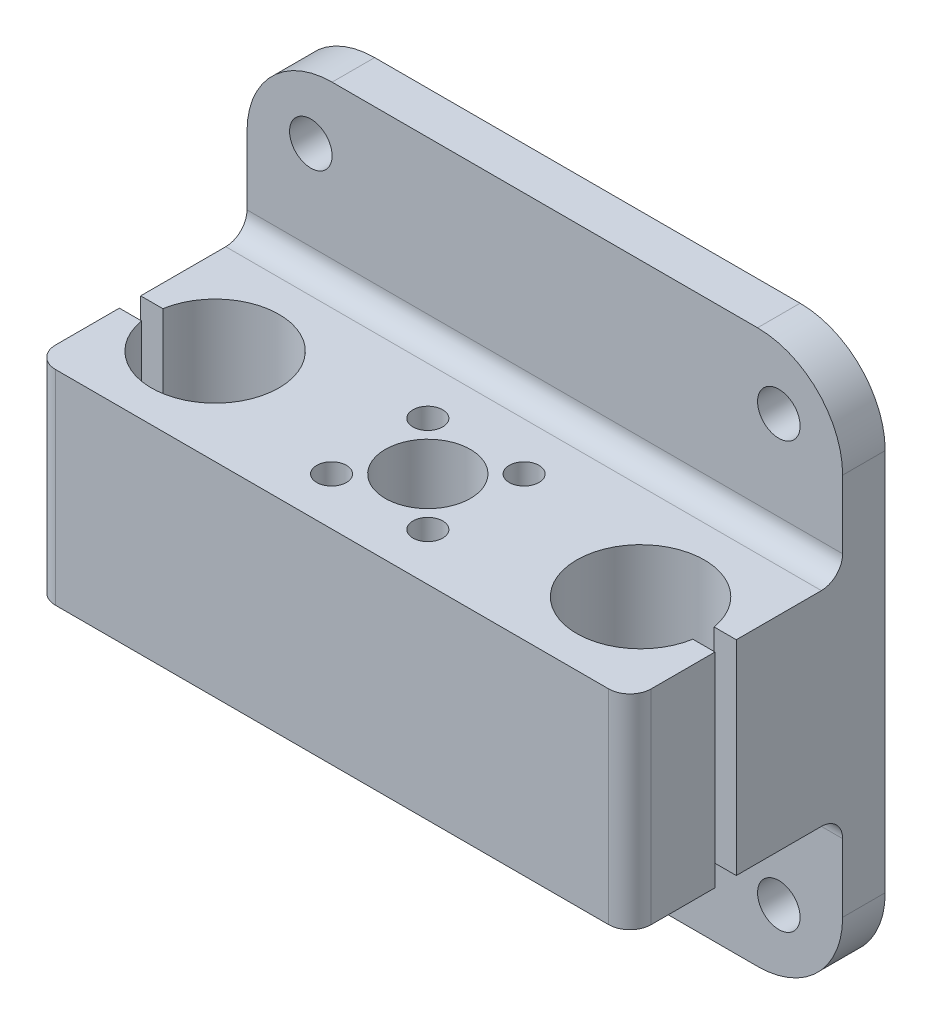
ISO-10303-21;
HEADER;
FILE_DESCRIPTION(('STEP AP214'),'2;1');
FILE_NAME('part.step','',(''),(''),'','','');
FILE_SCHEMA(('AUTOMOTIVE_DESIGN { 1 0 10303 214 1 1 1 1 }'));
ENDSEC;
DATA;
#1=APPLICATION_CONTEXT('core data for automotive mechanical design processes');
#2=APPLICATION_PROTOCOL_DEFINITION('international standard','automotive_design',2000,#1);
#3=PRODUCT_CONTEXT('',#1,'mechanical');
#4=PRODUCT('Part','Part','',(#3));
#5=PRODUCT_RELATED_PRODUCT_CATEGORY('part','',(#4));
#6=PRODUCT_DEFINITION_FORMATION('','',#4);
#7=PRODUCT_DEFINITION_CONTEXT('part definition',#1,'design');
#8=PRODUCT_DEFINITION('design','',#6,#7);
#9=PRODUCT_DEFINITION_SHAPE('','',#8);
#10=(LENGTH_UNIT() NAMED_UNIT(*) SI_UNIT(.MILLI.,.METRE.));
#11=(NAMED_UNIT(*) PLANE_ANGLE_UNIT() SI_UNIT($,.RADIAN.));
#12=(NAMED_UNIT(*) SI_UNIT($,.STERADIAN.) SOLID_ANGLE_UNIT());
#13=UNCERTAINTY_MEASURE_WITH_UNIT(LENGTH_MEASURE(1.E-05),#10,'distance_accuracy_value','');
#14=(GEOMETRIC_REPRESENTATION_CONTEXT(3) GLOBAL_UNCERTAINTY_ASSIGNED_CONTEXT((#13)) GLOBAL_UNIT_ASSIGNED_CONTEXT((#10,
#11,#12)) REPRESENTATION_CONTEXT('',''));
#15=CARTESIAN_POINT('',(0.,0.,0.));
#16=DIRECTION('',(0.,0.,1.));
#17=DIRECTION('',(1.,0.,0.));
#18=AXIS2_PLACEMENT_3D('',#15,#16,#17);
#19=CARTESIAN_POINT('',(-50.4878048780488,18.1707317073171,5.));
#20=DIRECTION('',(1.,0.,0.));
#21=DIRECTION('',(0.,1.,0.));
#22=AXIS2_PLACEMENT_3D('',#19,#20,#21);
#23=PLANE('',#22);
#24=DIRECTION('',(0.,0.,-1.));
#25=VECTOR('',#24,1.);
#26=CARTESIAN_POINT('',(-50.4878048780488,-26.3292682926829,30.));
#27=LINE('',#26,#25);
#28=CARTESIAN_POINT('',(-50.4878048780488,-26.3292682926829,17.5));
#29=VERTEX_POINT('',#28);
#30=CARTESIAN_POINT('',(-50.4878048780488,-26.3292682926829,7.5));
#31=VERTEX_POINT('',#30);
#32=EDGE_CURVE('E248',#29,#31,#27,.T.);
#33=ORIENTED_EDGE('',*,*,#32,.F.);
#34=DIRECTION('',(0.,1.,0.));
#35=VECTOR('',#34,1.);
#36=CARTESIAN_POINT('',(-50.4878048780488,18.1707317073171,17.5));
#37=LINE('',#36,#35);
#38=CARTESIAN_POINT('',(-50.4878048780488,-2.32926829268293,17.5));
#39=VERTEX_POINT('',#38);
#40=EDGE_CURVE('E480',#29,#39,#37,.T.);
#41=ORIENTED_EDGE('',*,*,#40,.T.);
#42=DIRECTION('',(0.,0.,-1.));
#43=VECTOR('',#42,1.);
#44=CARTESIAN_POINT('',(-50.4878048780488,-2.32926829268293,30.));
#45=LINE('',#44,#43);
#46=CARTESIAN_POINT('',(-50.4878048780488,-2.32926829268293,7.5));
#47=VERTEX_POINT('',#46);
#48=EDGE_CURVE('E240',#39,#47,#45,.T.);
#49=ORIENTED_EDGE('',*,*,#48,.T.);
#50=CARTESIAN_POINT('',(-50.4878048780488,0.170731707317066,7.5));
#51=DIRECTION('',(1.,0.,0.));
#52=DIRECTION('',(0.,1.,0.));
#53=AXIS2_PLACEMENT_3D('',#50,#51,#52);
#54=CIRCLE('',#53,2.5);
#55=CARTESIAN_POINT('',(-50.4878048780488,0.170731707317066,5.));
#56=VERTEX_POINT('',#55);
#57=EDGE_CURVE('E393',#47,#56,#54,.T.);
#58=ORIENTED_EDGE('',*,*,#57,.T.);
#59=DIRECTION('',(0.,-1.,0.));
#60=VECTOR('',#59,1.);
#61=CARTESIAN_POINT('',(-50.4878048780488,18.1707317073171,5.));
#62=LINE('',#61,#60);
#63=CARTESIAN_POINT('',(-50.4878048780488,8.17073170731707,5.));
#64=VERTEX_POINT('',#63);
#65=EDGE_CURVE('E286',#64,#56,#62,.T.);
#66=ORIENTED_EDGE('',*,*,#65,.F.);
#67=DIRECTION('',(0.,0.,-1.));
#68=VECTOR('',#67,1.);
#69=CARTESIAN_POINT('',(-50.4878048780488,8.17073170731707,5.));
#70=LINE('',#69,#68);
#71=CARTESIAN_POINT('',(-50.4878048780488,8.17073170731707,0.));
#72=VERTEX_POINT('',#71);
#73=EDGE_CURVE('E365',#64,#72,#70,.T.);
#74=ORIENTED_EDGE('',*,*,#73,.T.);
#75=DIRECTION('',(0.,-1.,0.));
#76=VECTOR('',#75,1.);
#77=CARTESIAN_POINT('',(-50.4878048780488,18.1707317073171,0.));
#78=LINE('',#77,#76);
#79=CARTESIAN_POINT('',(-50.4878048780488,-36.8292682926829,0.));
#80=VERTEX_POINT('',#79);
#81=EDGE_CURVE('E282',#72,#80,#78,.T.);
#82=ORIENTED_EDGE('',*,*,#81,.T.);
#83=DIRECTION('',(0.,0.,-1.));
#84=VECTOR('',#83,1.);
#85=CARTESIAN_POINT('',(-50.4878048780488,-36.8292682926829,5.));
#86=LINE('',#85,#84);
#87=CARTESIAN_POINT('',(-50.4878048780488,-36.8292682926829,5.));
#88=VERTEX_POINT('',#87);
#89=EDGE_CURVE('E369',#80,#88,#86,.F.);
#90=ORIENTED_EDGE('',*,*,#89,.T.);
#91=CARTESIAN_POINT('',(-50.4878048780488,-28.8292682926829,5.));
#92=VERTEX_POINT('',#91);
#93=EDGE_CURVE('E291',#92,#88,#62,.T.);
#94=ORIENTED_EDGE('',*,*,#93,.F.);
#95=CARTESIAN_POINT('',(-50.4878048780488,-28.8292682926829,7.5));
#96=DIRECTION('',(1.,0.,0.));
#97=DIRECTION('',(0.,1.,0.));
#98=AXIS2_PLACEMENT_3D('',#95,#96,#97);
#99=CIRCLE('',#98,2.5);
#100=EDGE_CURVE('E389',#92,#31,#99,.T.);
#101=ORIENTED_EDGE('',*,*,#100,.T.);
#102=EDGE_LOOP('',(#33,#41,#49,#58,#66,#74,#82,#90,#94,#101));
#103=FACE_BOUND('',#102,.T.);
#104=ADVANCED_FACE('F39',(#103),#23,.F.);
#105=CARTESIAN_POINT('',(19.5121951219512,18.1707317073171,5.));
#106=DIRECTION('',(-1.,0.,0.));
#107=DIRECTION('',(0.,-1.,0.));
#108=AXIS2_PLACEMENT_3D('',#105,#106,#107);
#109=PLANE('',#108);
#110=DIRECTION('',(0.,0.,-1.));
#111=VECTOR('',#110,1.);
#112=CARTESIAN_POINT('',(19.5121951219512,-26.3292682926829,30.));
#113=LINE('',#112,#111);
#114=CARTESIAN_POINT('',(19.5121951219512,-26.3292682926829,27.5));
#115=VERTEX_POINT('',#114);
#116=CARTESIAN_POINT('',(19.5121951219512,-26.3292682926829,20.));
#117=VERTEX_POINT('',#116);
#118=EDGE_CURVE('E244',#115,#117,#113,.T.);
#119=ORIENTED_EDGE('',*,*,#118,.T.);
#120=DIRECTION('',(0.,1.,0.));
#121=VECTOR('',#120,1.);
#122=CARTESIAN_POINT('',(19.5121951219512,18.1707317073171,20.));
#123=LINE('',#122,#121);
#124=CARTESIAN_POINT('',(19.5121951219512,-2.32926829268293,20.));
#125=VERTEX_POINT('',#124);
#126=EDGE_CURVE('E580',#117,#125,#123,.T.);
#127=ORIENTED_EDGE('',*,*,#126,.T.);
#128=DIRECTION('',(0.,0.,-1.));
#129=VECTOR('',#128,1.);
#130=CARTESIAN_POINT('',(19.5121951219512,-2.32926829268293,30.));
#131=LINE('',#130,#129);
#132=CARTESIAN_POINT('',(19.5121951219512,-2.32926829268293,27.5));
#133=VERTEX_POINT('',#132);
#134=EDGE_CURVE('E232',#133,#125,#131,.T.);
#135=ORIENTED_EDGE('',*,*,#134,.F.);
#136=DIRECTION('',(0.,1.,0.));
#137=VECTOR('',#136,1.);
#138=CARTESIAN_POINT('',(19.5121951219512,-26.3292682926829,27.5));
#139=LINE('',#138,#137);
#140=EDGE_CURVE('E412',#133,#115,#139,.F.);
#141=ORIENTED_EDGE('',*,*,#140,.T.);
#142=EDGE_LOOP('',(#119,#127,#135,#141));
#143=FACE_BOUND('',#142,.T.);
#144=ADVANCED_FACE('F547',(#143),#109,.F.);
#145=CARTESIAN_POINT('',(0.,0.,5.));
#146=DIRECTION('',(0.,0.,1.));
#147=DIRECTION('',(1.,0.,0.));
#148=AXIS2_PLACEMENT_3D('',#145,#146,#147);
#149=PLANE('',#148);
#150=ORIENTED_EDGE('',*,*,#65,.T.);
#151=DIRECTION('',(-1.,0.,0.));
#152=VECTOR('',#151,1.);
#153=CARTESIAN_POINT('',(0.,0.170731707317072,5.));
#154=LINE('',#153,#152);
#155=CARTESIAN_POINT('',(19.5121951219512,0.170731707317073,5.));
#156=VERTEX_POINT('',#155);
#157=EDGE_CURVE('E383',#56,#156,#154,.F.);
#158=ORIENTED_EDGE('',*,*,#157,.T.);
#159=DIRECTION('',(0.,1.,0.));
#160=VECTOR('',#159,1.);
#161=CARTESIAN_POINT('',(19.5121951219512,18.1707317073171,5.));
#162=LINE('',#161,#160);
#163=CARTESIAN_POINT('',(19.5121951219512,8.17073170731707,5.));
#164=VERTEX_POINT('',#163);
#165=EDGE_CURVE('E295',#156,#164,#162,.T.);
#166=ORIENTED_EDGE('',*,*,#165,.T.);
#167=CARTESIAN_POINT('',(9.51219512195122,8.17073170731707,5.));
#168=DIRECTION('',(0.,0.,1.));
#169=DIRECTION('',(1.,0.,0.));
#170=AXIS2_PLACEMENT_3D('',#167,#168,#169);
#171=CIRCLE('',#170,10.);
#172=CARTESIAN_POINT('',(9.51219512195122,18.1707317073171,5.));
#173=VERTEX_POINT('',#172);
#174=EDGE_CURVE('E352',#164,#173,#171,.T.);
#175=ORIENTED_EDGE('',*,*,#174,.T.);
#176=DIRECTION('',(-1.,0.,0.));
#177=VECTOR('',#176,1.);
#178=CARTESIAN_POINT('',(-50.4878048780488,18.1707317073171,5.));
#179=LINE('',#178,#177);
#180=CARTESIAN_POINT('',(-40.4878048780488,18.1707317073171,5.));
#181=VERTEX_POINT('',#180);
#182=EDGE_CURVE('E300',#173,#181,#179,.T.);
#183=ORIENTED_EDGE('',*,*,#182,.T.);
#184=CARTESIAN_POINT('',(-40.4878048780488,8.17073170731707,5.));
#185=DIRECTION('',(0.,0.,1.));
#186=DIRECTION('',(1.,0.,0.));
#187=AXIS2_PLACEMENT_3D('',#184,#185,#186);
#188=CIRCLE('',#187,10.);
#189=EDGE_CURVE('E346',#181,#64,#188,.T.);
#190=ORIENTED_EDGE('',*,*,#189,.T.);
#191=EDGE_LOOP('',(#150,#158,#166,#175,#183,#190));
#192=FACE_BOUND('',#191,.T.);
#193=CARTESIAN_POINT('',(12.0121951219512,10.6707317073171,5.));
#194=DIRECTION('',(0.,0.,1.));
#195=DIRECTION('',(1.,0.,0.));
#196=AXIS2_PLACEMENT_3D('',#193,#194,#195);
#197=CIRCLE('',#196,2.5);
#198=CARTESIAN_POINT('',(14.5121951219512,10.6707317073171,5.));
#199=VERTEX_POINT('',#198);
#200=EDGE_CURVE('E270',#199,#199,#197,.T.);
#201=ORIENTED_EDGE('',*,*,#200,.F.);
#202=EDGE_LOOP('',(#201));
#203=FACE_BOUND('',#202,.T.);
#204=CARTESIAN_POINT('',(-42.9878048780488,10.6707317073171,5.));
#205=DIRECTION('',(0.,0.,1.));
#206=DIRECTION('',(1.,0.,0.));
#207=AXIS2_PLACEMENT_3D('',#204,#205,#206);
#208=CIRCLE('',#207,2.5);
#209=CARTESIAN_POINT('',(-40.4878048780488,10.6707317073171,5.));
#210=VERTEX_POINT('',#209);
#211=EDGE_CURVE('E278',#210,#210,#208,.T.);
#212=ORIENTED_EDGE('',*,*,#211,.F.);
#213=EDGE_LOOP('',(#212));
#214=FACE_BOUND('',#213,.T.);
#215=ADVANCED_FACE('F485',(#192,#203,#214),#149,.T.);
#216=CARTESIAN_POINT('',(19.5121951219512,-36.8292682926829,5.));
#217=VERTEX_POINT('',#216);
#218=CARTESIAN_POINT('',(19.5121951219512,-28.8292682926829,5.));
#219=VERTEX_POINT('',#218);
#220=EDGE_CURVE('E296',#217,#219,#162,.T.);
#221=ORIENTED_EDGE('',*,*,#220,.T.);
#222=DIRECTION('',(1.,0.,0.));
#223=VECTOR('',#222,1.);
#224=CARTESIAN_POINT('',(0.,-28.8292682926829,5.));
#225=LINE('',#224,#223);
#226=EDGE_CURVE('E377',#219,#92,#225,.F.);
#227=ORIENTED_EDGE('',*,*,#226,.T.);
#228=ORIENTED_EDGE('',*,*,#93,.T.);
#229=CARTESIAN_POINT('',(-40.4878048780488,-36.8292682926829,5.));
#230=DIRECTION('',(0.,0.,1.));
#231=DIRECTION('',(1.,0.,0.));
#232=AXIS2_PLACEMENT_3D('',#229,#230,#231);
#233=CIRCLE('',#232,10.);
#234=CARTESIAN_POINT('',(-40.4878048780488,-46.8292682926829,5.));
#235=VERTEX_POINT('',#234);
#236=EDGE_CURVE('E349',#88,#235,#233,.T.);
#237=ORIENTED_EDGE('',*,*,#236,.T.);
#238=DIRECTION('',(1.,0.,0.));
#239=VECTOR('',#238,1.);
#240=CARTESIAN_POINT('',(-50.4878048780488,-46.8292682926829,5.));
#241=LINE('',#240,#239);
#242=CARTESIAN_POINT('',(9.51219512195123,-46.8292682926829,5.));
#243=VERTEX_POINT('',#242);
#244=EDGE_CURVE('E290',#235,#243,#241,.T.);
#245=ORIENTED_EDGE('',*,*,#244,.T.);
#246=CARTESIAN_POINT('',(9.51219512195123,-36.8292682926829,5.));
#247=DIRECTION('',(0.,0.,1.));
#248=DIRECTION('',(1.,0.,0.));
#249=AXIS2_PLACEMENT_3D('',#246,#247,#248);
#250=CIRCLE('',#249,10.);
#251=EDGE_CURVE('E355',#243,#217,#250,.T.);
#252=ORIENTED_EDGE('',*,*,#251,.T.);
#253=EDGE_LOOP('',(#221,#227,#228,#237,#245,#252));
#254=FACE_BOUND('',#253,.T.);
#255=CARTESIAN_POINT('',(-42.9878048780488,-39.3292682926829,5.));
#256=DIRECTION('',(0.,0.,1.));
#257=DIRECTION('',(1.,0.,0.));
#258=AXIS2_PLACEMENT_3D('',#255,#256,#257);
#259=CIRCLE('',#258,2.5);
#260=CARTESIAN_POINT('',(-40.4878048780488,-39.3292682926829,5.));
#261=VERTEX_POINT('',#260);
#262=EDGE_CURVE('E262',#261,#261,#259,.T.);
#263=ORIENTED_EDGE('',*,*,#262,.F.);
#264=EDGE_LOOP('',(#263));
#265=FACE_BOUND('',#264,.T.);
#266=CARTESIAN_POINT('',(12.0121951219512,-39.3292682926829,5.));
#267=DIRECTION('',(0.,0.,1.));
#268=DIRECTION('',(1.,0.,0.));
#269=AXIS2_PLACEMENT_3D('',#266,#267,#268);
#270=CIRCLE('',#269,2.5);
#271=CARTESIAN_POINT('',(14.5121951219512,-39.3292682926829,5.));
#272=VERTEX_POINT('',#271);
#273=EDGE_CURVE('E254',#272,#272,#270,.T.);
#274=ORIENTED_EDGE('',*,*,#273,.F.);
#275=EDGE_LOOP('',(#274));
#276=FACE_BOUND('',#275,.T.);
#277=ADVANCED_FACE('F506',(#254,#265,#276),#149,.T.);
#278=CARTESIAN_POINT('',(0.,0.,0.));
#279=DIRECTION('',(0.,0.,1.));
#280=DIRECTION('',(1.,0.,0.));
#281=AXIS2_PLACEMENT_3D('',#278,#279,#280);
#282=PLANE('',#281);
#283=DIRECTION('',(0.,1.,0.));
#284=VECTOR('',#283,1.);
#285=CARTESIAN_POINT('',(19.5121951219512,18.1707317073171,0.));
#286=LINE('',#285,#284);
#287=CARTESIAN_POINT('',(19.5121951219512,-36.8292682926829,0.));
#288=VERTEX_POINT('',#287);
#289=CARTESIAN_POINT('',(19.5121951219512,8.17073170731707,0.));
#290=VERTEX_POINT('',#289);
#291=EDGE_CURVE('E312',#288,#290,#286,.T.);
#292=ORIENTED_EDGE('',*,*,#291,.F.);
#293=CARTESIAN_POINT('',(9.51219512195123,-36.8292682926829,0.));
#294=DIRECTION('',(0.,0.,1.));
#295=DIRECTION('',(1.,0.,0.));
#296=AXIS2_PLACEMENT_3D('',#293,#294,#295);
#297=CIRCLE('',#296,10.);
#298=CARTESIAN_POINT('',(9.51219512195123,-46.8292682926829,0.));
#299=VERTEX_POINT('',#298);
#300=EDGE_CURVE('E336',#288,#299,#297,.F.);
#301=ORIENTED_EDGE('',*,*,#300,.T.);
#302=DIRECTION('',(1.,0.,0.));
#303=VECTOR('',#302,1.);
#304=CARTESIAN_POINT('',(-50.4878048780488,-46.8292682926829,0.));
#305=LINE('',#304,#303);
#306=CARTESIAN_POINT('',(-40.4878048780488,-46.8292682926829,0.));
#307=VERTEX_POINT('',#306);
#308=EDGE_CURVE('E308',#307,#299,#305,.T.);
#309=ORIENTED_EDGE('',*,*,#308,.F.);
#310=CARTESIAN_POINT('',(-40.4878048780488,-36.8292682926829,0.));
#311=DIRECTION('',(0.,0.,1.));
#312=DIRECTION('',(1.,0.,0.));
#313=AXIS2_PLACEMENT_3D('',#310,#311,#312);
#314=CIRCLE('',#313,10.);
#315=EDGE_CURVE('E330',#307,#80,#314,.F.);
#316=ORIENTED_EDGE('',*,*,#315,.T.);
#317=ORIENTED_EDGE('',*,*,#81,.F.);
#318=CARTESIAN_POINT('',(-40.4878048780488,8.17073170731707,0.));
#319=DIRECTION('',(0.,0.,1.));
#320=DIRECTION('',(1.,0.,0.));
#321=AXIS2_PLACEMENT_3D('',#318,#319,#320);
#322=CIRCLE('',#321,10.);
#323=CARTESIAN_POINT('',(-40.4878048780488,18.1707317073171,0.));
#324=VERTEX_POINT('',#323);
#325=EDGE_CURVE('E327',#72,#324,#322,.F.);
#326=ORIENTED_EDGE('',*,*,#325,.T.);
#327=DIRECTION('',(-1.,0.,0.));
#328=VECTOR('',#327,1.);
#329=CARTESIAN_POINT('',(-50.4878048780488,18.1707317073171,0.));
#330=LINE('',#329,#328);
#331=CARTESIAN_POINT('',(9.51219512195122,18.1707317073171,0.));
#332=VERTEX_POINT('',#331);
#333=EDGE_CURVE('E316',#332,#324,#330,.T.);
#334=ORIENTED_EDGE('',*,*,#333,.F.);
#335=CARTESIAN_POINT('',(9.51219512195122,8.17073170731707,0.));
#336=DIRECTION('',(0.,0.,1.));
#337=DIRECTION('',(1.,0.,0.));
#338=AXIS2_PLACEMENT_3D('',#335,#336,#337);
#339=CIRCLE('',#338,10.);
#340=EDGE_CURVE('E333',#332,#290,#339,.F.);
#341=ORIENTED_EDGE('',*,*,#340,.T.);
#342=EDGE_LOOP('',(#292,#301,#309,#316,#317,#326,#334,#341));
#343=FACE_BOUND('',#342,.T.);
#344=CARTESIAN_POINT('',(-42.9878048780488,10.6707317073171,0.));
#345=DIRECTION('',(0.,0.,1.));
#346=DIRECTION('',(1.,0.,0.));
#347=AXIS2_PLACEMENT_3D('',#344,#345,#346);
#348=CIRCLE('',#347,2.5);
#349=CARTESIAN_POINT('',(-40.4878048780488,10.6707317073171,0.));
#350=VERTEX_POINT('',#349);
#351=EDGE_CURVE('E274',#350,#350,#348,.T.);
#352=ORIENTED_EDGE('',*,*,#351,.T.);
#353=EDGE_LOOP('',(#352));
#354=FACE_BOUND('',#353,.T.);
#355=CARTESIAN_POINT('',(12.0121951219512,10.6707317073171,0.));
#356=DIRECTION('',(0.,0.,1.));
#357=DIRECTION('',(1.,0.,0.));
#358=AXIS2_PLACEMENT_3D('',#355,#356,#357);
#359=CIRCLE('',#358,2.5);
#360=CARTESIAN_POINT('',(14.5121951219512,10.6707317073171,0.));
#361=VERTEX_POINT('',#360);
#362=EDGE_CURVE('E266',#361,#361,#359,.T.);
#363=ORIENTED_EDGE('',*,*,#362,.T.);
#364=EDGE_LOOP('',(#363));
#365=FACE_BOUND('',#364,.T.);
#366=CARTESIAN_POINT('',(-42.9878048780488,-39.3292682926829,0.));
#367=DIRECTION('',(0.,0.,1.));
#368=DIRECTION('',(1.,0.,0.));
#369=AXIS2_PLACEMENT_3D('',#366,#367,#368);
#370=CIRCLE('',#369,2.5);
#371=CARTESIAN_POINT('',(-40.4878048780488,-39.3292682926829,0.));
#372=VERTEX_POINT('',#371);
#373=EDGE_CURVE('E258',#372,#372,#370,.T.);
#374=ORIENTED_EDGE('',*,*,#373,.T.);
#375=EDGE_LOOP('',(#374));
#376=FACE_BOUND('',#375,.T.);
#377=CARTESIAN_POINT('',(12.0121951219512,-39.3292682926829,0.));
#378=DIRECTION('',(0.,0.,1.));
#379=DIRECTION('',(1.,0.,0.));
#380=AXIS2_PLACEMENT_3D('',#377,#378,#379);
#381=CIRCLE('',#380,2.5);
#382=CARTESIAN_POINT('',(14.5121951219512,-39.3292682926829,0.));
#383=VERTEX_POINT('',#382);
#384=EDGE_CURVE('E253',#383,#383,#381,.T.);
#385=ORIENTED_EDGE('',*,*,#384,.T.);
#386=EDGE_LOOP('',(#385));
#387=FACE_BOUND('',#386,.T.);
#388=ADVANCED_FACE('F517',(#343,#354,#365,#376,#387),#282,.F.);
#389=CARTESIAN_POINT('',(-50.4878048780488,-2.32926829268293,27.5));
#390=VERTEX_POINT('',#389);
#391=CARTESIAN_POINT('',(-50.4878048780488,-2.32926829268293,20.));
#392=VERTEX_POINT('',#391);
#393=EDGE_CURVE('E233',#390,#392,#45,.T.);
#394=ORIENTED_EDGE('',*,*,#393,.T.);
#395=DIRECTION('',(0.,-1.,0.));
#396=VECTOR('',#395,1.);
#397=CARTESIAN_POINT('',(-50.4878048780488,18.1707317073171,20.));
#398=LINE('',#397,#396);
#399=CARTESIAN_POINT('',(-50.4878048780488,-26.3292682926829,20.));
#400=VERTEX_POINT('',#399);
#401=EDGE_CURVE('E565',#392,#400,#398,.T.);
#402=ORIENTED_EDGE('',*,*,#401,.T.);
#403=CARTESIAN_POINT('',(-50.4878048780488,-26.3292682926829,27.5));
#404=VERTEX_POINT('',#403);
#405=EDGE_CURVE('E249',#404,#400,#27,.T.);
#406=ORIENTED_EDGE('',*,*,#405,.F.);
#407=DIRECTION('',(0.,-1.,0.));
#408=VECTOR('',#407,1.);
#409=CARTESIAN_POINT('',(-50.4878048780488,-2.32926829268293,27.5));
#410=LINE('',#409,#408);
#411=EDGE_CURVE('E421',#404,#390,#410,.F.);
#412=ORIENTED_EDGE('',*,*,#411,.T.);
#413=EDGE_LOOP('',(#394,#402,#406,#412));
#414=FACE_BOUND('',#413,.T.);
#415=ADVANCED_FACE('F549',(#414),#23,.F.);
#416=CARTESIAN_POINT('',(-50.4878048780488,-46.8292682926829,5.));
#417=DIRECTION('',(0.,1.,0.));
#418=DIRECTION('',(0.,0.,1.));
#419=AXIS2_PLACEMENT_3D('',#416,#417,#418);
#420=PLANE('',#419);
#421=ORIENTED_EDGE('',*,*,#308,.T.);
#422=DIRECTION('',(0.,0.,-1.));
#423=VECTOR('',#422,1.);
#424=CARTESIAN_POINT('',(9.51219512195123,-46.8292682926829,5.));
#425=LINE('',#424,#423);
#426=EDGE_CURVE('E343',#299,#243,#425,.F.);
#427=ORIENTED_EDGE('',*,*,#426,.T.);
#428=ORIENTED_EDGE('',*,*,#244,.F.);
#429=DIRECTION('',(0.,0.,-1.));
#430=VECTOR('',#429,1.);
#431=CARTESIAN_POINT('',(-40.4878048780488,-46.8292682926829,5.));
#432=LINE('',#431,#430);
#433=EDGE_CURVE('E339',#235,#307,#432,.T.);
#434=ORIENTED_EDGE('',*,*,#433,.T.);
#435=EDGE_LOOP('',(#421,#427,#428,#434));
#436=FACE_BOUND('',#435,.T.);
#437=ADVANCED_FACE('F520',(#436),#420,.F.);
#438=CARTESIAN_POINT('',(19.5121951219512,-2.32926829268293,17.5));
#439=VERTEX_POINT('',#438);
#440=CARTESIAN_POINT('',(19.5121951219512,-2.32926829268293,7.5));
#441=VERTEX_POINT('',#440);
#442=EDGE_CURVE('E218',#439,#441,#131,.T.);
#443=ORIENTED_EDGE('',*,*,#442,.F.);
#444=DIRECTION('',(0.,-1.,0.));
#445=VECTOR('',#444,1.);
#446=CARTESIAN_POINT('',(19.5121951219512,18.1707317073171,17.5));
#447=LINE('',#446,#445);
#448=CARTESIAN_POINT('',(19.5121951219512,-26.3292682926829,17.5));
#449=VERTEX_POINT('',#448);
#450=EDGE_CURVE('E199',#439,#449,#447,.T.);
#451=ORIENTED_EDGE('',*,*,#450,.T.);
#452=CARTESIAN_POINT('',(19.5121951219512,-26.3292682926829,7.5));
#453=VERTEX_POINT('',#452);
#454=EDGE_CURVE('E238',#449,#453,#113,.T.);
#455=ORIENTED_EDGE('',*,*,#454,.T.);
#456=CARTESIAN_POINT('',(19.5121951219512,-28.8292682926829,7.5));
#457=DIRECTION('',(-1.,0.,0.));
#458=DIRECTION('',(0.,-1.,0.));
#459=AXIS2_PLACEMENT_3D('',#456,#457,#458);
#460=CIRCLE('',#459,2.5);
#461=EDGE_CURVE('E386',#453,#219,#460,.T.);
#462=ORIENTED_EDGE('',*,*,#461,.T.);
#463=ORIENTED_EDGE('',*,*,#220,.F.);
#464=DIRECTION('',(0.,0.,-1.));
#465=VECTOR('',#464,1.);
#466=CARTESIAN_POINT('',(19.5121951219512,-36.8292682926829,5.));
#467=LINE('',#466,#465);
#468=EDGE_CURVE('E323',#217,#288,#467,.T.);
#469=ORIENTED_EDGE('',*,*,#468,.T.);
#470=ORIENTED_EDGE('',*,*,#291,.T.);
#471=DIRECTION('',(0.,0.,-1.));
#472=VECTOR('',#471,1.);
#473=CARTESIAN_POINT('',(19.5121951219512,8.17073170731707,5.));
#474=LINE('',#473,#472);
#475=EDGE_CURVE('E304',#290,#164,#474,.F.);
#476=ORIENTED_EDGE('',*,*,#475,.T.);
#477=ORIENTED_EDGE('',*,*,#165,.F.);
#478=CARTESIAN_POINT('',(19.5121951219512,0.170731707317075,7.5));
#479=DIRECTION('',(-1.,0.,0.));
#480=DIRECTION('',(0.,-1.,0.));
#481=AXIS2_PLACEMENT_3D('',#478,#479,#480);
#482=CIRCLE('',#481,2.5);
#483=EDGE_CURVE('E229',#156,#441,#482,.T.);
#484=ORIENTED_EDGE('',*,*,#483,.T.);
#485=EDGE_LOOP('',(#443,#451,#455,#462,#463,#469,#470,#476,#477,#484));
#486=FACE_BOUND('',#485,.T.);
#487=ADVANCED_FACE('F226',(#486),#109,.F.);
#488=CARTESIAN_POINT('',(-50.4878048780488,18.1707317073171,5.));
#489=DIRECTION('',(0.,-1.,0.));
#490=DIRECTION('',(0.,0.,-1.));
#491=AXIS2_PLACEMENT_3D('',#488,#489,#490);
#492=PLANE('',#491);
#493=ORIENTED_EDGE('',*,*,#182,.F.);
#494=DIRECTION('',(0.,0.,-1.));
#495=VECTOR('',#494,1.);
#496=CARTESIAN_POINT('',(9.51219512195122,18.1707317073171,5.));
#497=LINE('',#496,#495);
#498=EDGE_CURVE('E361',#173,#332,#497,.T.);
#499=ORIENTED_EDGE('',*,*,#498,.T.);
#500=ORIENTED_EDGE('',*,*,#333,.T.);
#501=DIRECTION('',(0.,0.,-1.));
#502=VECTOR('',#501,1.);
#503=CARTESIAN_POINT('',(-40.4878048780488,18.1707317073171,5.));
#504=LINE('',#503,#502);
#505=EDGE_CURVE('E358',#324,#181,#504,.F.);
#506=ORIENTED_EDGE('',*,*,#505,.T.);
#507=EDGE_LOOP('',(#493,#499,#500,#506));
#508=FACE_BOUND('',#507,.T.);
#509=ADVANCED_FACE('F533',(#508),#492,.F.);
#510=CARTESIAN_POINT('',(-42.9878048780488,10.6707317073171,5.));
#511=DIRECTION('',(0.,0.,-1.));
#512=DIRECTION('',(-1.,0.,0.));
#513=AXIS2_PLACEMENT_3D('',#510,#511,#512);
#514=CYLINDRICAL_SURFACE('',#513,2.5);
#515=ORIENTED_EDGE('',*,*,#211,.T.);
#516=EDGE_LOOP('',(#515));
#517=FACE_BOUND('',#516,.T.);
#518=ORIENTED_EDGE('',*,*,#351,.F.);
#519=EDGE_LOOP('',(#518));
#520=FACE_BOUND('',#519,.T.);
#521=ADVANCED_FACE('F674',(#517,#520),#514,.F.);
#522=CARTESIAN_POINT('',(12.0121951219512,10.6707317073171,5.));
#523=DIRECTION('',(0.,0.,-1.));
#524=DIRECTION('',(-1.,0.,0.));
#525=AXIS2_PLACEMENT_3D('',#522,#523,#524);
#526=CYLINDRICAL_SURFACE('',#525,2.5);
#527=ORIENTED_EDGE('',*,*,#200,.T.);
#528=EDGE_LOOP('',(#527));
#529=FACE_BOUND('',#528,.T.);
#530=ORIENTED_EDGE('',*,*,#362,.F.);
#531=EDGE_LOOP('',(#530));
#532=FACE_BOUND('',#531,.T.);
#533=ADVANCED_FACE('F670',(#529,#532),#526,.F.);
#534=CARTESIAN_POINT('',(-42.9878048780488,-39.3292682926829,5.));
#535=DIRECTION('',(0.,0.,-1.));
#536=DIRECTION('',(-1.,0.,0.));
#537=AXIS2_PLACEMENT_3D('',#534,#535,#536);
#538=CYLINDRICAL_SURFACE('',#537,2.5);
#539=ORIENTED_EDGE('',*,*,#262,.T.);
#540=EDGE_LOOP('',(#539));
#541=FACE_BOUND('',#540,.T.);
#542=ORIENTED_EDGE('',*,*,#373,.F.);
#543=EDGE_LOOP('',(#542));
#544=FACE_BOUND('',#543,.T.);
#545=ADVANCED_FACE('F666',(#541,#544),#538,.F.);
#546=CARTESIAN_POINT('',(12.0121951219512,-39.3292682926829,5.));
#547=DIRECTION('',(0.,0.,-1.));
#548=DIRECTION('',(-1.,0.,0.));
#549=AXIS2_PLACEMENT_3D('',#546,#547,#548);
#550=CYLINDRICAL_SURFACE('',#549,2.5);
#551=ORIENTED_EDGE('',*,*,#273,.T.);
#552=EDGE_LOOP('',(#551));
#553=FACE_BOUND('',#552,.T.);
#554=ORIENTED_EDGE('',*,*,#384,.F.);
#555=EDGE_LOOP('',(#554));
#556=FACE_BOUND('',#555,.T.);
#557=ADVANCED_FACE('F544',(#553,#556),#550,.F.);
#558=CARTESIAN_POINT('',(9.51219512195123,-36.8292682926829,5.));
#559=DIRECTION('',(0.,0.,-1.));
#560=DIRECTION('',(-1.,0.,0.));
#561=AXIS2_PLACEMENT_3D('',#558,#559,#560);
#562=CYLINDRICAL_SURFACE('',#561,10.);
#563=ORIENTED_EDGE('',*,*,#251,.F.);
#564=ORIENTED_EDGE('',*,*,#426,.F.);
#565=ORIENTED_EDGE('',*,*,#300,.F.);
#566=ORIENTED_EDGE('',*,*,#468,.F.);
#567=EDGE_LOOP('',(#563,#564,#565,#566));
#568=FACE_BOUND('',#567,.T.);
#569=ADVANCED_FACE('F513',(#568),#562,.T.);
#570=CARTESIAN_POINT('',(9.51219512195122,8.17073170731707,5.));
#571=DIRECTION('',(0.,0.,-1.));
#572=DIRECTION('',(-1.,0.,0.));
#573=AXIS2_PLACEMENT_3D('',#570,#571,#572);
#574=CYLINDRICAL_SURFACE('',#573,10.);
#575=ORIENTED_EDGE('',*,*,#174,.F.);
#576=ORIENTED_EDGE('',*,*,#475,.F.);
#577=ORIENTED_EDGE('',*,*,#340,.F.);
#578=ORIENTED_EDGE('',*,*,#498,.F.);
#579=EDGE_LOOP('',(#575,#576,#577,#578));
#580=FACE_BOUND('',#579,.T.);
#581=ADVANCED_FACE('F536',(#580),#574,.T.);
#582=CARTESIAN_POINT('',(-40.4878048780488,-36.8292682926829,5.));
#583=DIRECTION('',(0.,0.,-1.));
#584=DIRECTION('',(-1.,0.,0.));
#585=AXIS2_PLACEMENT_3D('',#582,#583,#584);
#586=CYLINDRICAL_SURFACE('',#585,10.);
#587=ORIENTED_EDGE('',*,*,#236,.F.);
#588=ORIENTED_EDGE('',*,*,#89,.F.);
#589=ORIENTED_EDGE('',*,*,#315,.F.);
#590=ORIENTED_EDGE('',*,*,#433,.F.);
#591=EDGE_LOOP('',(#587,#588,#589,#590));
#592=FACE_BOUND('',#591,.T.);
#593=ADVANCED_FACE('F523',(#592),#586,.T.);
#594=CARTESIAN_POINT('',(-40.4878048780488,8.17073170731707,5.));
#595=DIRECTION('',(0.,0.,-1.));
#596=DIRECTION('',(-1.,0.,0.));
#597=AXIS2_PLACEMENT_3D('',#594,#595,#596);
#598=CYLINDRICAL_SURFACE('',#597,10.);
#599=ORIENTED_EDGE('',*,*,#189,.F.);
#600=ORIENTED_EDGE('',*,*,#505,.F.);
#601=ORIENTED_EDGE('',*,*,#325,.F.);
#602=ORIENTED_EDGE('',*,*,#73,.F.);
#603=EDGE_LOOP('',(#599,#600,#601,#602));
#604=FACE_BOUND('',#603,.T.);
#605=ADVANCED_FACE('F528',(#604),#598,.T.);
#606=CARTESIAN_POINT('',(19.5121951219512,-26.3292682926829,30.));
#607=DIRECTION('',(0.,1.,0.));
#608=DIRECTION('',(-1.,0.,0.));
#609=AXIS2_PLACEMENT_3D('',#606,#607,#608);
#610=PLANE('',#609);
#611=CARTESIAN_POINT('',(-21.1446591275412,-26.3292682926829,24.4068542494924));
#612=DIRECTION('',(0.,1.,0.));
#613=DIRECTION('',(-1.,0.,0.));
#614=AXIS2_PLACEMENT_3D('',#611,#612,#613);
#615=CIRCLE('',#614,1.75);
#616=CARTESIAN_POINT('',(-22.8946591275412,-26.3292682926829,24.4068542494924));
#617=VERTEX_POINT('',#616);
#618=EDGE_CURVE('E451',#617,#617,#615,.T.);
#619=ORIENTED_EDGE('',*,*,#618,.T.);
#620=EDGE_LOOP('',(#619));
#621=FACE_BOUND('',#620,.T.);
#622=CARTESIAN_POINT('',(-9.83095062855642,-26.3292682926829,24.4068542494924));
#623=DIRECTION('',(0.,1.,0.));
#624=DIRECTION('',(-1.,0.,0.));
#625=AXIS2_PLACEMENT_3D('',#622,#623,#624);
#626=CIRCLE('',#625,1.75);
#627=CARTESIAN_POINT('',(-11.5809506285564,-26.3292682926829,24.4068542494924));
#628=VERTEX_POINT('',#627);
#629=EDGE_CURVE('E619',#628,#628,#626,.T.);
#630=ORIENTED_EDGE('',*,*,#629,.T.);
#631=EDGE_LOOP('',(#630));
#632=FACE_BOUND('',#631,.T.);
#633=CARTESIAN_POINT('',(-9.8309506285564,-26.3292682926829,13.0931457505077));
#634=DIRECTION('',(0.,1.,0.));
#635=DIRECTION('',(-1.,0.,0.));
#636=AXIS2_PLACEMENT_3D('',#633,#634,#635);
#637=CIRCLE('',#636,1.75);
#638=CARTESIAN_POINT('',(-11.5809506285564,-26.3292682926829,13.0931457505077));
#639=VERTEX_POINT('',#638);
#640=EDGE_CURVE('E616',#639,#639,#637,.T.);
#641=ORIENTED_EDGE('',*,*,#640,.T.);
#642=EDGE_LOOP('',(#641));
#643=FACE_BOUND('',#642,.T.);
#644=CARTESIAN_POINT('',(-21.1446591275411,-26.3292682926829,13.0931457505076));
#645=DIRECTION('',(0.,1.,0.));
#646=DIRECTION('',(-1.,0.,0.));
#647=AXIS2_PLACEMENT_3D('',#644,#645,#646);
#648=CIRCLE('',#647,1.75);
#649=CARTESIAN_POINT('',(-22.8946591275411,-26.3292682926829,13.0931457505076));
#650=VERTEX_POINT('',#649);
#651=EDGE_CURVE('E612',#650,#650,#648,.T.);
#652=ORIENTED_EDGE('',*,*,#651,.T.);
#653=EDGE_LOOP('',(#652));
#654=FACE_BOUND('',#653,.T.);
#655=CARTESIAN_POINT('',(-15.4878048780488,-26.3292682926829,18.75));
#656=DIRECTION('',(0.,1.,0.));
#657=DIRECTION('',(-1.,0.,0.));
#658=AXIS2_PLACEMENT_3D('',#655,#656,#657);
#659=CIRCLE('',#658,5.);
#660=CARTESIAN_POINT('',(-20.4878048780488,-26.3292682926829,18.75));
#661=VERTEX_POINT('',#660);
#662=EDGE_CURVE('E449',#661,#661,#659,.T.);
#663=ORIENTED_EDGE('',*,*,#662,.T.);
#664=EDGE_LOOP('',(#663));
#665=FACE_BOUND('',#664,.T.);
#666=CARTESIAN_POINT('',(-40.4878048780488,-26.3292682926829,18.75));
#667=DIRECTION('',(0.,1.,0.));
#668=DIRECTION('',(-1.,0.,0.));
#669=AXIS2_PLACEMENT_3D('',#666,#667,#668);
#670=CIRCLE('',#669,7.5);
#671=CARTESIAN_POINT('',(-47.8829046069233,-26.3292682926829,20.));
#672=VERTEX_POINT('',#671);
#673=CARTESIAN_POINT('',(-47.8829046069233,-26.3292682926829,17.5));
#674=VERTEX_POINT('',#673);
#675=EDGE_CURVE('E438',#672,#674,#670,.T.);
#676=ORIENTED_EDGE('',*,*,#675,.T.);
#677=DIRECTION('',(-1.,0.,0.));
#678=VECTOR('',#677,1.);
#679=CARTESIAN_POINT('',(19.5121951219512,-26.3292682926829,17.5));
#680=LINE('',#679,#678);
#681=EDGE_CURVE('E55',#674,#29,#680,.T.);
#682=ORIENTED_EDGE('',*,*,#681,.T.);
#683=ORIENTED_EDGE('',*,*,#32,.T.);
#684=DIRECTION('',(1.,0.,0.));
#685=VECTOR('',#684,1.);
#686=CARTESIAN_POINT('',(19.5121951219512,-26.3292682926829,7.5));
#687=LINE('',#686,#685);
#688=EDGE_CURVE('E373',#31,#453,#687,.T.);
#689=ORIENTED_EDGE('',*,*,#688,.T.);
#690=ORIENTED_EDGE('',*,*,#454,.F.);
#691=DIRECTION('',(-1.,0.,0.));
#692=VECTOR('',#691,1.);
#693=CARTESIAN_POINT('',(19.5121951219512,-26.3292682926829,17.5));
#694=LINE('',#693,#692);
#695=CARTESIAN_POINT('',(16.9072948508257,-26.3292682926829,17.5));
#696=VERTEX_POINT('',#695);
#697=EDGE_CURVE('E205',#449,#696,#694,.T.);
#698=ORIENTED_EDGE('',*,*,#697,.T.);
#699=CARTESIAN_POINT('',(9.51219512195122,-26.3292682926829,18.75));
#700=DIRECTION('',(0.,1.,0.));
#701=DIRECTION('',(-1.,0.,0.));
#702=AXIS2_PLACEMENT_3D('',#699,#700,#701);
#703=CIRCLE('',#702,7.5);
#704=CARTESIAN_POINT('',(16.9072948508257,-26.3292682926829,20.));
#705=VERTEX_POINT('',#704);
#706=EDGE_CURVE('E461',#696,#705,#703,.T.);
#707=ORIENTED_EDGE('',*,*,#706,.T.);
#708=DIRECTION('',(1.,0.,0.));
#709=VECTOR('',#708,1.);
#710=CARTESIAN_POINT('',(19.5121951219512,-26.3292682926829,20.));
#711=LINE('',#710,#709);
#712=EDGE_CURVE('E210',#705,#117,#711,.T.);
#713=ORIENTED_EDGE('',*,*,#712,.T.);
#714=ORIENTED_EDGE('',*,*,#118,.F.);
#715=CARTESIAN_POINT('',(17.0121951219512,-26.3292682926829,27.5));
#716=DIRECTION('',(0.,1.,0.));
#717=DIRECTION('',(-1.,0.,0.));
#718=AXIS2_PLACEMENT_3D('',#715,#716,#717);
#719=CIRCLE('',#718,2.5);
#720=CARTESIAN_POINT('',(17.0121951219512,-26.3292682926829,30.));
#721=VERTEX_POINT('',#720);
#722=EDGE_CURVE('E418',#115,#721,#719,.F.);
#723=ORIENTED_EDGE('',*,*,#722,.T.);
#724=DIRECTION('',(1.,0.,0.));
#725=VECTOR('',#724,1.);
#726=CARTESIAN_POINT('',(19.5121951219512,-26.3292682926829,30.));
#727=LINE('',#726,#725);
#728=CARTESIAN_POINT('',(-47.9878048780488,-26.3292682926829,30.));
#729=VERTEX_POINT('',#728);
#730=EDGE_CURVE('E465',#729,#721,#727,.T.);
#731=ORIENTED_EDGE('',*,*,#730,.F.);
#732=CARTESIAN_POINT('',(-47.9878048780488,-26.3292682926829,27.5));
#733=DIRECTION('',(0.,1.,0.));
#734=DIRECTION('',(-1.,0.,0.));
#735=AXIS2_PLACEMENT_3D('',#732,#733,#734);
#736=CIRCLE('',#735,2.5);
#737=EDGE_CURVE('E415',#729,#404,#736,.F.);
#738=ORIENTED_EDGE('',*,*,#737,.T.);
#739=ORIENTED_EDGE('',*,*,#405,.T.);
#740=DIRECTION('',(1.,0.,0.));
#741=VECTOR('',#740,1.);
#742=CARTESIAN_POINT('',(19.5121951219512,-26.3292682926829,20.));
#743=LINE('',#742,#741);
#744=EDGE_CURVE('E583',#400,#672,#743,.T.);
#745=ORIENTED_EDGE('',*,*,#744,.T.);
#746=EDGE_LOOP('',(#676,#682,#683,#689,#690,#698,#707,#713,#714,#723,#731,#738,#739,#745));
#747=FACE_BOUND('',#746,.T.);
#748=ADVANCED_FACE('F501',(#621,#632,#643,#654,#665,#747),#610,.F.);
#749=CARTESIAN_POINT('',(19.5121951219512,-2.32926829268293,30.));
#750=DIRECTION('',(0.,-1.,0.));
#751=DIRECTION('',(1.,0.,0.));
#752=AXIS2_PLACEMENT_3D('',#749,#750,#751);
#753=PLANE('',#752);
#754=CARTESIAN_POINT('',(-21.1446591275412,-2.32926829268293,24.4068542494924));
#755=DIRECTION('',(0.,1.,0.));
#756=DIRECTION('',(-1.,0.,0.));
#757=AXIS2_PLACEMENT_3D('',#754,#755,#756);
#758=CIRCLE('',#757,1.75);
#759=CARTESIAN_POINT('',(-22.8946591275412,-2.32926829268293,24.4068542494924));
#760=VERTEX_POINT('',#759);
#761=EDGE_CURVE('E596',#760,#760,#758,.T.);
#762=ORIENTED_EDGE('',*,*,#761,.F.);
#763=EDGE_LOOP('',(#762));
#764=FACE_BOUND('',#763,.T.);
#765=CARTESIAN_POINT('',(-9.83095062855643,-2.32926829268293,24.4068542494924));
#766=DIRECTION('',(0.,1.,0.));
#767=DIRECTION('',(-1.,0.,0.));
#768=AXIS2_PLACEMENT_3D('',#765,#766,#767);
#769=CIRCLE('',#768,1.75);
#770=CARTESIAN_POINT('',(-11.5809506285564,-2.32926829268293,24.4068542494924));
#771=VERTEX_POINT('',#770);
#772=EDGE_CURVE('E602',#771,#771,#769,.T.);
#773=ORIENTED_EDGE('',*,*,#772,.F.);
#774=EDGE_LOOP('',(#773));
#775=FACE_BOUND('',#774,.T.);
#776=CARTESIAN_POINT('',(-9.83095062855641,-2.32926829268293,13.0931457505077));
#777=DIRECTION('',(0.,1.,0.));
#778=DIRECTION('',(-1.,0.,0.));
#779=AXIS2_PLACEMENT_3D('',#776,#777,#778);
#780=CIRCLE('',#779,1.75);
#781=CARTESIAN_POINT('',(-11.5809506285564,-2.32926829268293,13.0931457505077));
#782=VERTEX_POINT('',#781);
#783=EDGE_CURVE('E597',#782,#782,#780,.T.);
#784=ORIENTED_EDGE('',*,*,#783,.F.);
#785=EDGE_LOOP('',(#784));
#786=FACE_BOUND('',#785,.T.);
#787=CARTESIAN_POINT('',(-21.1446591275411,-2.32926829268293,13.0931457505076));
#788=DIRECTION('',(0.,1.,0.));
#789=DIRECTION('',(-1.,0.,0.));
#790=AXIS2_PLACEMENT_3D('',#787,#788,#789);
#791=CIRCLE('',#790,1.75);
#792=CARTESIAN_POINT('',(-22.8946591275411,-2.32926829268293,13.0931457505076));
#793=VERTEX_POINT('',#792);
#794=EDGE_CURVE('E601',#793,#793,#791,.T.);
#795=ORIENTED_EDGE('',*,*,#794,.F.);
#796=EDGE_LOOP('',(#795));
#797=FACE_BOUND('',#796,.T.);
#798=ORIENTED_EDGE('',*,*,#48,.F.);
#799=DIRECTION('',(-1.,0.,0.));
#800=VECTOR('',#799,1.);
#801=CARTESIAN_POINT('',(-43.7209063166483,-2.32926829268293,17.5));
#802=LINE('',#801,#800);
#803=CARTESIAN_POINT('',(-47.8829046069233,-2.32926829268293,17.5));
#804=VERTEX_POINT('',#803);
#805=EDGE_CURVE('E442',#804,#39,#802,.T.);
#806=ORIENTED_EDGE('',*,*,#805,.F.);
#807=CARTESIAN_POINT('',(-40.4878048780488,-2.32926829268293,18.75));
#808=DIRECTION('',(0.,1.,0.));
#809=DIRECTION('',(-1.,0.,0.));
#810=AXIS2_PLACEMENT_3D('',#807,#808,#809);
#811=CIRCLE('',#810,7.5);
#812=CARTESIAN_POINT('',(-47.8829046069233,-2.32926829268294,20.));
#813=VERTEX_POINT('',#812);
#814=EDGE_CURVE('E436',#813,#804,#811,.T.);
#815=ORIENTED_EDGE('',*,*,#814,.F.);
#816=DIRECTION('',(1.,0.,0.));
#817=VECTOR('',#816,1.);
#818=CARTESIAN_POINT('',(-43.7209063166483,-2.32926829268293,20.));
#819=LINE('',#818,#817);
#820=EDGE_CURVE('E62',#392,#813,#819,.T.);
#821=ORIENTED_EDGE('',*,*,#820,.F.);
#822=ORIENTED_EDGE('',*,*,#393,.F.);
#823=CARTESIAN_POINT('',(-47.9878048780488,-2.32926829268293,27.5));
#824=DIRECTION('',(0.,-1.,0.));
#825=DIRECTION('',(1.,0.,0.));
#826=AXIS2_PLACEMENT_3D('',#823,#824,#825);
#827=CIRCLE('',#826,2.5);
#828=CARTESIAN_POINT('',(-47.9878048780488,-2.32926829268293,30.));
#829=VERTEX_POINT('',#828);
#830=EDGE_CURVE('E406',#390,#829,#827,.F.);
#831=ORIENTED_EDGE('',*,*,#830,.T.);
#832=DIRECTION('',(-1.,0.,0.));
#833=VECTOR('',#832,1.);
#834=CARTESIAN_POINT('',(19.5121951219512,-2.32926829268293,30.));
#835=LINE('',#834,#833);
#836=CARTESIAN_POINT('',(17.0121951219512,-2.32926829268293,30.));
#837=VERTEX_POINT('',#836);
#838=EDGE_CURVE('E468',#837,#829,#835,.T.);
#839=ORIENTED_EDGE('',*,*,#838,.F.);
#840=CARTESIAN_POINT('',(17.0121951219512,-2.32926829268293,27.5));
#841=DIRECTION('',(0.,-1.,0.));
#842=DIRECTION('',(1.,0.,0.));
#843=AXIS2_PLACEMENT_3D('',#840,#841,#842);
#844=CIRCLE('',#843,2.5);
#845=EDGE_CURVE('E409',#837,#133,#844,.F.);
#846=ORIENTED_EDGE('',*,*,#845,.T.);
#847=ORIENTED_EDGE('',*,*,#134,.T.);
#848=DIRECTION('',(1.,0.,0.));
#849=VECTOR('',#848,1.);
#850=CARTESIAN_POINT('',(10.5677581491694,-2.32926829268293,20.));
#851=LINE('',#850,#849);
#852=CARTESIAN_POINT('',(16.9072948508257,-2.32926829268293,20.));
#853=VERTEX_POINT('',#852);
#854=EDGE_CURVE('E224',#853,#125,#851,.T.);
#855=ORIENTED_EDGE('',*,*,#854,.F.);
#856=CARTESIAN_POINT('',(9.51219512195122,-2.32926829268293,18.75));
#857=DIRECTION('',(0.,1.,0.));
#858=DIRECTION('',(-1.,0.,0.));
#859=AXIS2_PLACEMENT_3D('',#856,#857,#858);
#860=CIRCLE('',#859,7.5);
#861=CARTESIAN_POINT('',(16.9072948508257,-2.32926829268293,17.5));
#862=VERTEX_POINT('',#861);
#863=EDGE_CURVE('E222',#862,#853,#860,.T.);
#864=ORIENTED_EDGE('',*,*,#863,.F.);
#865=DIRECTION('',(-1.,0.,0.));
#866=VECTOR('',#865,1.);
#867=CARTESIAN_POINT('',(10.5677581491694,-2.32926829268293,17.5));
#868=LINE('',#867,#866);
#869=EDGE_CURVE('E202',#439,#862,#868,.T.);
#870=ORIENTED_EDGE('',*,*,#869,.F.);
#871=ORIENTED_EDGE('',*,*,#442,.T.);
#872=DIRECTION('',(-1.,0.,0.));
#873=VECTOR('',#872,1.);
#874=CARTESIAN_POINT('',(19.5121951219512,-2.32926829268293,7.5));
#875=LINE('',#874,#873);
#876=EDGE_CURVE('E380',#441,#47,#875,.T.);
#877=ORIENTED_EDGE('',*,*,#876,.T.);
#878=EDGE_LOOP('',(#798,#806,#815,#821,#822,#831,#839,#846,#847,#855,#864,#870,#871,#877));
#879=FACE_BOUND('',#878,.T.);
#880=CARTESIAN_POINT('',(-15.4878048780488,-2.32926829268293,18.75));
#881=DIRECTION('',(0.,1.,0.));
#882=DIRECTION('',(-1.,0.,0.));
#883=AXIS2_PLACEMENT_3D('',#880,#881,#882);
#884=CIRCLE('',#883,5.);
#885=CARTESIAN_POINT('',(-20.4878048780488,-2.32926829268293,18.75));
#886=VERTEX_POINT('',#885);
#887=EDGE_CURVE('E444',#886,#886,#884,.T.);
#888=ORIENTED_EDGE('',*,*,#887,.F.);
#889=EDGE_LOOP('',(#888));
#890=FACE_BOUND('',#889,.T.);
#891=ADVANCED_FACE('F215',(#764,#775,#786,#797,#879,#890),#753,.F.);
#892=CARTESIAN_POINT('',(0.,0.,30.));
#893=DIRECTION('',(0.,0.,1.));
#894=DIRECTION('',(1.,0.,0.));
#895=AXIS2_PLACEMENT_3D('',#892,#893,#894);
#896=PLANE('',#895);
#897=ORIENTED_EDGE('',*,*,#730,.T.);
#898=DIRECTION('',(0.,1.,0.));
#899=VECTOR('',#898,1.);
#900=CARTESIAN_POINT('',(17.0121951219512,-2.32926829268293,30.));
#901=LINE('',#900,#899);
#902=EDGE_CURVE('E402',#721,#837,#901,.T.);
#903=ORIENTED_EDGE('',*,*,#902,.T.);
#904=ORIENTED_EDGE('',*,*,#838,.T.);
#905=DIRECTION('',(0.,-1.,0.));
#906=VECTOR('',#905,1.);
#907=CARTESIAN_POINT('',(-47.9878048780488,-26.3292682926829,30.));
#908=LINE('',#907,#906);
#909=EDGE_CURVE('E398',#829,#729,#908,.T.);
#910=ORIENTED_EDGE('',*,*,#909,.T.);
#911=EDGE_LOOP('',(#897,#903,#904,#910));
#912=FACE_BOUND('',#911,.T.);
#913=ADVANCED_FACE('F570',(#912),#896,.T.);
#914=CARTESIAN_POINT('',(19.5121951219512,-28.8292682926829,7.5));
#915=DIRECTION('',(1.,0.,0.));
#916=DIRECTION('',(0.,1.,0.));
#917=AXIS2_PLACEMENT_3D('',#914,#915,#916);
#918=CYLINDRICAL_SURFACE('',#917,2.5);
#919=ORIENTED_EDGE('',*,*,#100,.F.);
#920=ORIENTED_EDGE('',*,*,#226,.F.);
#921=ORIENTED_EDGE('',*,*,#461,.F.);
#922=ORIENTED_EDGE('',*,*,#688,.F.);
#923=EDGE_LOOP('',(#919,#920,#921,#922));
#924=FACE_BOUND('',#923,.T.);
#925=ADVANCED_FACE('F500',(#924),#918,.F.);
#926=CARTESIAN_POINT('',(19.5121951219512,0.170731707317075,7.5));
#927=DIRECTION('',(-1.,0.,0.));
#928=DIRECTION('',(0.,-1.,0.));
#929=AXIS2_PLACEMENT_3D('',#926,#927,#928);
#930=CYLINDRICAL_SURFACE('',#929,2.5);
#931=ORIENTED_EDGE('',*,*,#483,.F.);
#932=ORIENTED_EDGE('',*,*,#157,.F.);
#933=ORIENTED_EDGE('',*,*,#57,.F.);
#934=ORIENTED_EDGE('',*,*,#876,.F.);
#935=EDGE_LOOP('',(#931,#932,#933,#934));
#936=FACE_BOUND('',#935,.T.);
#937=ADVANCED_FACE('F483',(#936),#930,.F.);
#938=CARTESIAN_POINT('',(-15.4878048780488,-32.3292682926829,18.75));
#939=DIRECTION('',(0.,1.,0.));
#940=DIRECTION('',(-1.,0.,0.));
#941=AXIS2_PLACEMENT_3D('',#938,#939,#940);
#942=CYLINDRICAL_SURFACE('',#941,5.);
#943=ORIENTED_EDGE('',*,*,#887,.T.);
#944=EDGE_LOOP('',(#943));
#945=FACE_BOUND('',#944,.T.);
#946=ORIENTED_EDGE('',*,*,#662,.F.);
#947=EDGE_LOOP('',(#946));
#948=FACE_BOUND('',#947,.T.);
#949=ADVANCED_FACE('F650',(#945,#948),#942,.F.);
#950=CARTESIAN_POINT('',(-40.4878048780488,-32.3292682926829,18.75));
#951=DIRECTION('',(0.,1.,0.));
#952=DIRECTION('',(-1.,0.,0.));
#953=AXIS2_PLACEMENT_3D('',#950,#951,#952);
#954=CYLINDRICAL_SURFACE('',#953,7.5);
#955=ORIENTED_EDGE('',*,*,#814,.T.);
#956=DIRECTION('',(0.,1.,0.));
#957=VECTOR('',#956,1.);
#958=CARTESIAN_POINT('',(-47.8829046069233,-32.3292682926829,17.5));
#959=LINE('',#958,#957);
#960=EDGE_CURVE('E11',#804,#674,#959,.F.);
#961=ORIENTED_EDGE('',*,*,#960,.T.);
#962=ORIENTED_EDGE('',*,*,#675,.F.);
#963=DIRECTION('',(0.,1.,0.));
#964=VECTOR('',#963,1.);
#965=CARTESIAN_POINT('',(-47.8829046069233,-32.3292682926829,20.));
#966=LINE('',#965,#964);
#967=EDGE_CURVE('E48',#672,#813,#966,.T.);
#968=ORIENTED_EDGE('',*,*,#967,.T.);
#969=EDGE_LOOP('',(#955,#961,#962,#968));
#970=FACE_BOUND('',#969,.T.);
#971=ADVANCED_FACE('F435',(#970),#954,.F.);
#972=CARTESIAN_POINT('',(9.51219512195123,-32.3292682926829,18.75));
#973=DIRECTION('',(0.,1.,0.));
#974=DIRECTION('',(-1.,0.,0.));
#975=AXIS2_PLACEMENT_3D('',#972,#973,#974);
#976=CYLINDRICAL_SURFACE('',#975,7.5);
#977=ORIENTED_EDGE('',*,*,#863,.T.);
#978=DIRECTION('',(0.,1.,0.));
#979=VECTOR('',#978,1.);
#980=CARTESIAN_POINT('',(16.9072948508257,-32.3292682926829,20.));
#981=LINE('',#980,#979);
#982=EDGE_CURVE('E427',#853,#705,#981,.F.);
#983=ORIENTED_EDGE('',*,*,#982,.T.);
#984=ORIENTED_EDGE('',*,*,#706,.F.);
#985=DIRECTION('',(0.,1.,0.));
#986=VECTOR('',#985,1.);
#987=CARTESIAN_POINT('',(16.9072948508257,-32.3292682926829,17.5));
#988=LINE('',#987,#986);
#989=EDGE_CURVE('E424',#696,#862,#988,.T.);
#990=ORIENTED_EDGE('',*,*,#989,.T.);
#991=EDGE_LOOP('',(#977,#983,#984,#990));
#992=FACE_BOUND('',#991,.T.);
#993=ADVANCED_FACE('F646',(#992),#976,.F.);
#994=CARTESIAN_POINT('',(-21.1446591275411,-32.3292682926829,13.0931457505076));
#995=DIRECTION('',(0.,1.,0.));
#996=DIRECTION('',(-1.,0.,0.));
#997=AXIS2_PLACEMENT_3D('',#994,#995,#996);
#998=CYLINDRICAL_SURFACE('',#997,1.75);
#999=ORIENTED_EDGE('',*,*,#794,.T.);
#1000=EDGE_LOOP('',(#999));
#1001=FACE_BOUND('',#1000,.T.);
#1002=ORIENTED_EDGE('',*,*,#651,.F.);
#1003=EDGE_LOOP('',(#1002));
#1004=FACE_BOUND('',#1003,.T.);
#1005=ADVANCED_FACE('F643',(#1001,#1004),#998,.F.);
#1006=CARTESIAN_POINT('',(-9.8309506285564,-32.3292682926829,13.0931457505077));
#1007=DIRECTION('',(0.,1.,0.));
#1008=DIRECTION('',(-1.,0.,0.));
#1009=AXIS2_PLACEMENT_3D('',#1006,#1007,#1008);
#1010=CYLINDRICAL_SURFACE('',#1009,1.75);
#1011=ORIENTED_EDGE('',*,*,#783,.T.);
#1012=EDGE_LOOP('',(#1011));
#1013=FACE_BOUND('',#1012,.T.);
#1014=ORIENTED_EDGE('',*,*,#640,.F.);
#1015=EDGE_LOOP('',(#1014));
#1016=FACE_BOUND('',#1015,.T.);
#1017=ADVANCED_FACE('F638',(#1013,#1016),#1010,.F.);
#1018=CARTESIAN_POINT('',(-9.83095062855642,-32.3292682926829,24.4068542494924));
#1019=DIRECTION('',(0.,1.,0.));
#1020=DIRECTION('',(-1.,0.,0.));
#1021=AXIS2_PLACEMENT_3D('',#1018,#1019,#1020);
#1022=CYLINDRICAL_SURFACE('',#1021,1.75);
#1023=ORIENTED_EDGE('',*,*,#772,.T.);
#1024=EDGE_LOOP('',(#1023));
#1025=FACE_BOUND('',#1024,.T.);
#1026=ORIENTED_EDGE('',*,*,#629,.F.);
#1027=EDGE_LOOP('',(#1026));
#1028=FACE_BOUND('',#1027,.T.);
#1029=ADVANCED_FACE('F631',(#1025,#1028),#1022,.F.);
#1030=CARTESIAN_POINT('',(-21.1446591275412,-32.3292682926829,24.4068542494924));
#1031=DIRECTION('',(0.,1.,0.));
#1032=DIRECTION('',(-1.,0.,0.));
#1033=AXIS2_PLACEMENT_3D('',#1030,#1031,#1032);
#1034=CYLINDRICAL_SURFACE('',#1033,1.75);
#1035=ORIENTED_EDGE('',*,*,#761,.T.);
#1036=EDGE_LOOP('',(#1035));
#1037=FACE_BOUND('',#1036,.T.);
#1038=ORIENTED_EDGE('',*,*,#618,.F.);
#1039=EDGE_LOOP('',(#1038));
#1040=FACE_BOUND('',#1039,.T.);
#1041=ADVANCED_FACE('F629',(#1037,#1040),#1034,.F.);
#1042=CARTESIAN_POINT('',(17.0121951219512,0.,27.5));
#1043=DIRECTION('',(0.,-1.,0.));
#1044=DIRECTION('',(1.,0.,0.));
#1045=AXIS2_PLACEMENT_3D('',#1042,#1043,#1044);
#1046=CYLINDRICAL_SURFACE('',#1045,2.5);
#1047=ORIENTED_EDGE('',*,*,#722,.F.);
#1048=ORIENTED_EDGE('',*,*,#140,.F.);
#1049=ORIENTED_EDGE('',*,*,#845,.F.);
#1050=ORIENTED_EDGE('',*,*,#902,.F.);
#1051=EDGE_LOOP('',(#1047,#1048,#1049,#1050));
#1052=FACE_BOUND('',#1051,.T.);
#1053=ADVANCED_FACE('F577',(#1052),#1046,.T.);
#1054=CARTESIAN_POINT('',(-47.9878048780488,0.,27.5));
#1055=DIRECTION('',(0.,1.,0.));
#1056=DIRECTION('',(-1.,0.,0.));
#1057=AXIS2_PLACEMENT_3D('',#1054,#1055,#1056);
#1058=CYLINDRICAL_SURFACE('',#1057,2.5);
#1059=ORIENTED_EDGE('',*,*,#830,.F.);
#1060=ORIENTED_EDGE('',*,*,#411,.F.);
#1061=ORIENTED_EDGE('',*,*,#737,.F.);
#1062=ORIENTED_EDGE('',*,*,#909,.F.);
#1063=EDGE_LOOP('',(#1059,#1060,#1061,#1062));
#1064=FACE_BOUND('',#1063,.T.);
#1065=ADVANCED_FACE('F41',(#1064),#1058,.T.);
#1066=CARTESIAN_POINT('',(10.5677581491694,-32.3292682926829,17.5));
#1067=DIRECTION('',(0.,0.,-1.));
#1068=DIRECTION('',(-1.,0.,0.));
#1069=AXIS2_PLACEMENT_3D('',#1066,#1067,#1068);
#1070=PLANE('',#1069);
#1071=ORIENTED_EDGE('',*,*,#869,.T.);
#1072=ORIENTED_EDGE('',*,*,#989,.F.);
#1073=ORIENTED_EDGE('',*,*,#697,.F.);
#1074=ORIENTED_EDGE('',*,*,#450,.F.);
#1075=EDGE_LOOP('',(#1071,#1072,#1073,#1074));
#1076=FACE_BOUND('',#1075,.T.);
#1077=ADVANCED_FACE('F201',(#1076),#1070,.F.);
#1078=CARTESIAN_POINT('',(10.5677581491694,-32.3292682926829,20.));
#1079=DIRECTION('',(0.,0.,1.));
#1080=DIRECTION('',(1.,0.,0.));
#1081=AXIS2_PLACEMENT_3D('',#1078,#1079,#1080);
#1082=PLANE('',#1081);
#1083=ORIENTED_EDGE('',*,*,#712,.F.);
#1084=ORIENTED_EDGE('',*,*,#982,.F.);
#1085=ORIENTED_EDGE('',*,*,#854,.T.);
#1086=ORIENTED_EDGE('',*,*,#126,.F.);
#1087=EDGE_LOOP('',(#1083,#1084,#1085,#1086));
#1088=FACE_BOUND('',#1087,.T.);
#1089=ADVANCED_FACE('F866',(#1088),#1082,.F.);
#1090=CARTESIAN_POINT('',(-43.7209063166483,-32.3292682926829,20.));
#1091=DIRECTION('',(0.,0.,1.));
#1092=DIRECTION('',(1.,0.,0.));
#1093=AXIS2_PLACEMENT_3D('',#1090,#1091,#1092);
#1094=PLANE('',#1093);
#1095=ORIENTED_EDGE('',*,*,#820,.T.);
#1096=ORIENTED_EDGE('',*,*,#967,.F.);
#1097=ORIENTED_EDGE('',*,*,#744,.F.);
#1098=ORIENTED_EDGE('',*,*,#401,.F.);
#1099=EDGE_LOOP('',(#1095,#1096,#1097,#1098));
#1100=FACE_BOUND('',#1099,.T.);
#1101=ADVANCED_FACE('F875',(#1100),#1094,.F.);
#1102=CARTESIAN_POINT('',(-43.7209063166483,-32.3292682926829,17.5));
#1103=DIRECTION('',(0.,0.,-1.));
#1104=DIRECTION('',(-1.,0.,0.));
#1105=AXIS2_PLACEMENT_3D('',#1102,#1103,#1104);
#1106=PLANE('',#1105);
#1107=ORIENTED_EDGE('',*,*,#681,.F.);
#1108=ORIENTED_EDGE('',*,*,#960,.F.);
#1109=ORIENTED_EDGE('',*,*,#805,.T.);
#1110=ORIENTED_EDGE('',*,*,#40,.F.);
#1111=EDGE_LOOP('',(#1107,#1108,#1109,#1110));
#1112=FACE_BOUND('',#1111,.T.);
#1113=ADVANCED_FACE('F884',(#1112),#1106,.F.);
#1114=CLOSED_SHELL('',(#104,#144,#215,#277,#388,#415,#437,#487,#509,#521,#533,#545,#557,#569,
#581,#593,#605,#748,#891,#913,#925,#937,#949,#971,#993,#1005,#1017,#1029,#1041,#1053,#1065,
#1077,#1089,#1101,#1113));
#1115=MANIFOLD_SOLID_BREP('B2',#1114);
#1116=ADVANCED_BREP_SHAPE_REPRESENTATION('',(#18,#1115),#14);
#1117=SHAPE_DEFINITION_REPRESENTATION(#9,#1116);
ENDSEC;
END-ISO-10303-21;
